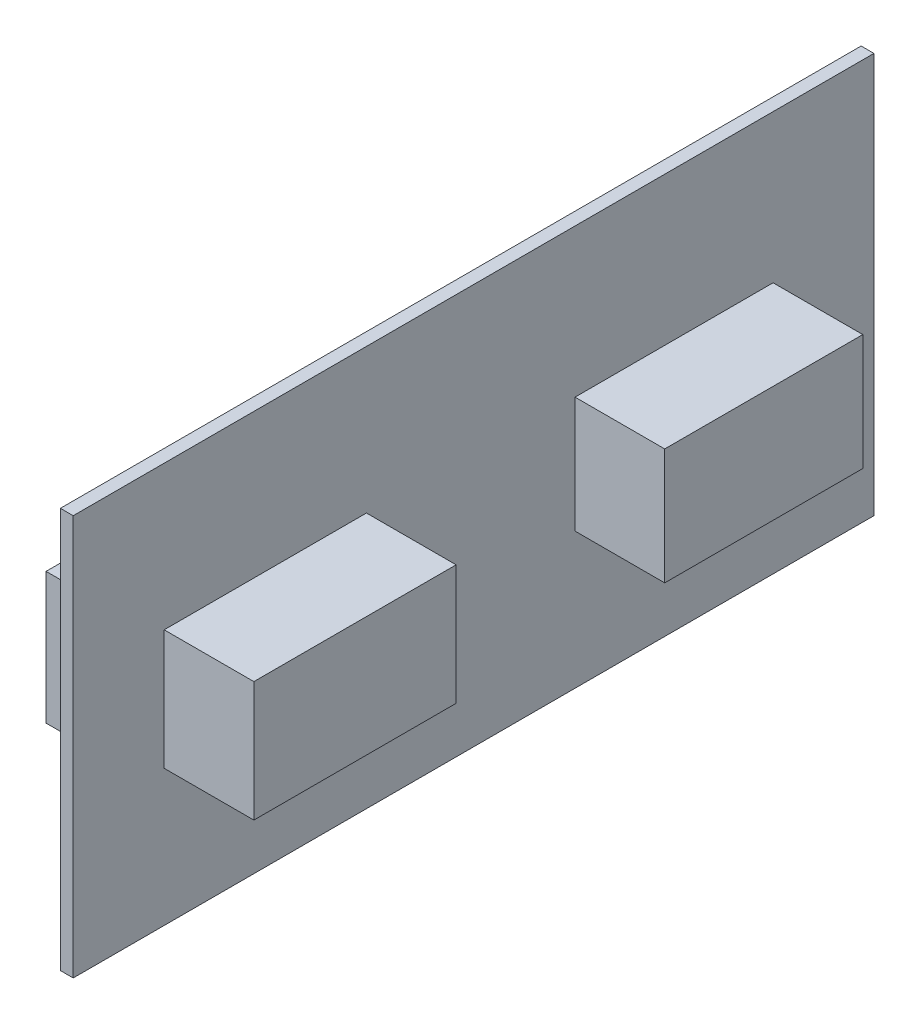
ISO-10303-21;
HEADER;
FILE_DESCRIPTION(('STEP AP214'),'2;1');
FILE_NAME('part.step','',(''),(''),'','','');
FILE_SCHEMA(('AUTOMOTIVE_DESIGN { 1 0 10303 214 1 1 1 1 }'));
ENDSEC;
DATA;
#1=APPLICATION_CONTEXT('core data for automotive mechanical design processes');
#2=APPLICATION_PROTOCOL_DEFINITION('international standard','automotive_design',2000,#1);
#3=PRODUCT_CONTEXT('',#1,'mechanical');
#4=PRODUCT('Part','Part','',(#3));
#5=PRODUCT_RELATED_PRODUCT_CATEGORY('part','',(#4));
#6=PRODUCT_DEFINITION_FORMATION('','',#4);
#7=PRODUCT_DEFINITION_CONTEXT('part definition',#1,'design');
#8=PRODUCT_DEFINITION('design','',#6,#7);
#9=PRODUCT_DEFINITION_SHAPE('','',#8);
#10=(LENGTH_UNIT() NAMED_UNIT(*) SI_UNIT(.MILLI.,.METRE.));
#11=(NAMED_UNIT(*) PLANE_ANGLE_UNIT() SI_UNIT($,.RADIAN.));
#12=(NAMED_UNIT(*) SI_UNIT($,.STERADIAN.) SOLID_ANGLE_UNIT());
#13=UNCERTAINTY_MEASURE_WITH_UNIT(LENGTH_MEASURE(1.E-05),#10,'distance_accuracy_value','');
#14=(GEOMETRIC_REPRESENTATION_CONTEXT(3) GLOBAL_UNCERTAINTY_ASSIGNED_CONTEXT((#13)) GLOBAL_UNIT_ASSIGNED_CONTEXT((#10,
#11,#12)) REPRESENTATION_CONTEXT('',''));
#15=CARTESIAN_POINT('',(0.,0.,0.));
#16=DIRECTION('',(0.,0.,1.));
#17=DIRECTION('',(1.,0.,0.));
#18=AXIS2_PLACEMENT_3D('',#15,#16,#17);
#19=CARTESIAN_POINT('',(8.,0.,0.));
#20=DIRECTION('',(1.,0.,0.));
#21=DIRECTION('',(0.,0.,-1.));
#22=AXIS2_PLACEMENT_3D('',#19,#20,#21);
#23=PLANE('',#22);
#24=DIRECTION('',(0.,0.,1.));
#25=VECTOR('',#24,1.);
#26=CARTESIAN_POINT('',(8.,159.890579244106,316.89479761036));
#27=LINE('',#26,#25);
#28=CARTESIAN_POINT('',(8.,159.890579244106,316.89479761036));
#29=VERTEX_POINT('',#28);
#30=CARTESIAN_POINT('',(8.,159.890579244106,443.194900394769));
#31=VERTEX_POINT('',#30);
#32=EDGE_CURVE('E201',#29,#31,#27,.T.);
#33=ORIENTED_EDGE('',*,*,#32,.F.);
#34=DIRECTION('',(0.,1.,0.));
#35=VECTOR('',#34,1.);
#36=CARTESIAN_POINT('',(8.,84.9918210853673,316.89479761036));
#37=LINE('',#36,#35);
#38=CARTESIAN_POINT('',(8.,84.9918210853673,316.89479761036));
#39=VERTEX_POINT('',#38);
#40=EDGE_CURVE('E198',#39,#29,#37,.T.);
#41=ORIENTED_EDGE('',*,*,#40,.F.);
#42=DIRECTION('',(0.,0.,-1.));
#43=VECTOR('',#42,1.);
#44=CARTESIAN_POINT('',(8.,84.9918210853673,316.89479761036));
#45=LINE('',#44,#43);
#46=CARTESIAN_POINT('',(8.,84.9918210853673,443.194900394769));
#47=VERTEX_POINT('',#46);
#48=EDGE_CURVE('E210',#47,#39,#45,.T.);
#49=ORIENTED_EDGE('',*,*,#48,.F.);
#50=DIRECTION('',(0.,-1.,0.));
#51=VECTOR('',#50,1.);
#52=CARTESIAN_POINT('',(8.,84.9918210853673,443.194900394769));
#53=LINE('',#52,#51);
#54=EDGE_CURVE('E218',#31,#47,#53,.T.);
#55=ORIENTED_EDGE('',*,*,#54,.F.);
#56=EDGE_LOOP('',(#33,#41,#49,#55));
#57=FACE_BOUND('',#56,.T.);
#58=DIRECTION('',(0.,1.,0.));
#59=VECTOR('',#58,1.);
#60=CARTESIAN_POINT('',(8.,0.,0.));
#61=LINE('',#60,#59);
#62=CARTESIAN_POINT('',(8.,0.,0.));
#63=VERTEX_POINT('',#62);
#64=CARTESIAN_POINT('',(8.,250.,0.));
#65=VERTEX_POINT('',#64);
#66=EDGE_CURVE('E296',#63,#65,#61,.T.);
#67=ORIENTED_EDGE('',*,*,#66,.T.);
#68=DIRECTION('',(0.,0.,1.));
#69=VECTOR('',#68,1.);
#70=CARTESIAN_POINT('',(8.,250.,0.));
#71=LINE('',#70,#69);
#72=CARTESIAN_POINT('',(8.,250.,500.));
#73=VERTEX_POINT('',#72);
#74=EDGE_CURVE('E299',#65,#73,#71,.T.);
#75=ORIENTED_EDGE('',*,*,#74,.T.);
#76=DIRECTION('',(0.,-1.,0.));
#77=VECTOR('',#76,1.);
#78=CARTESIAN_POINT('',(8.,0.,500.));
#79=LINE('',#78,#77);
#80=CARTESIAN_POINT('',(8.,0.,500.));
#81=VERTEX_POINT('',#80);
#82=EDGE_CURVE('E302',#73,#81,#79,.T.);
#83=ORIENTED_EDGE('',*,*,#82,.T.);
#84=DIRECTION('',(0.,0.,-1.));
#85=VECTOR('',#84,1.);
#86=CARTESIAN_POINT('',(8.,0.,0.));
#87=LINE('',#86,#85);
#88=EDGE_CURVE('E304',#81,#63,#87,.T.);
#89=ORIENTED_EDGE('',*,*,#88,.T.);
#90=EDGE_LOOP('',(#67,#75,#83,#89));
#91=FACE_BOUND('',#90,.T.);
#92=DIRECTION('',(0.,0.,-1.));
#93=VECTOR('',#92,1.);
#94=CARTESIAN_POINT('',(8.,84.9918210853673,186.644801378378));
#95=LINE('',#94,#93);
#96=CARTESIAN_POINT('',(8.,84.9918210853673,186.644801378378));
#97=VERTEX_POINT('',#96);
#98=CARTESIAN_POINT('',(8.,84.9918210853673,62.9638706911351));
#99=VERTEX_POINT('',#98);
#100=EDGE_CURVE('E596',#97,#99,#95,.T.);
#101=ORIENTED_EDGE('',*,*,#100,.F.);
#102=DIRECTION('',(0.,-1.,0.));
#103=VECTOR('',#102,1.);
#104=CARTESIAN_POINT('',(8.,84.9918210853673,186.644801378378));
#105=LINE('',#104,#103);
#106=CARTESIAN_POINT('',(8.,157.435600201589,186.644801378378));
#107=VERTEX_POINT('',#106);
#108=EDGE_CURVE('E196',#107,#97,#105,.T.);
#109=ORIENTED_EDGE('',*,*,#108,.F.);
#110=DIRECTION('',(0.,0.,1.));
#111=VECTOR('',#110,1.);
#112=CARTESIAN_POINT('',(8.,157.435600201589,186.644801378378));
#113=LINE('',#112,#111);
#114=CARTESIAN_POINT('',(8.,157.435600201589,62.9638706911351));
#115=VERTEX_POINT('',#114);
#116=EDGE_CURVE('E192',#115,#107,#113,.T.);
#117=ORIENTED_EDGE('',*,*,#116,.F.);
#118=DIRECTION('',(0.,1.,0.));
#119=VECTOR('',#118,1.);
#120=CARTESIAN_POINT('',(8.,84.9918210853673,62.9638706911351));
#121=LINE('',#120,#119);
#122=EDGE_CURVE('E593',#99,#115,#121,.T.);
#123=ORIENTED_EDGE('',*,*,#122,.F.);
#124=EDGE_LOOP('',(#101,#109,#117,#123));
#125=FACE_BOUND('',#124,.T.);
#126=ADVANCED_FACE('F35',(#57,#91,#125),#23,.T.);
#127=CARTESIAN_POINT('',(0.,0.,0.));
#128=DIRECTION('',(1.,0.,0.));
#129=DIRECTION('',(0.,0.,-1.));
#130=AXIS2_PLACEMENT_3D('',#127,#128,#129);
#131=PLANE('',#130);
#132=DIRECTION('',(0.,-1.,0.));
#133=VECTOR('',#132,1.);
#134=CARTESIAN_POINT('',(0.,164.379022571797,56.140342989849));
#135=LINE('',#134,#133);
#136=CARTESIAN_POINT('',(0.,164.379022571797,56.140342989849));
#137=VERTEX_POINT('',#136);
#138=CARTESIAN_POINT('',(0.,82.2983494640326,56.140342989849));
#139=VERTEX_POINT('',#138);
#140=EDGE_CURVE('E262',#137,#139,#135,.T.);
#141=ORIENTED_EDGE('',*,*,#140,.F.);
#142=DIRECTION('',(0.,0.,-1.));
#143=VECTOR('',#142,1.);
#144=CARTESIAN_POINT('',(0.,164.379022571797,56.140342989849));
#145=LINE('',#144,#143);
#146=CARTESIAN_POINT('',(0.,164.379022571797,183.007504960074));
#147=VERTEX_POINT('',#146);
#148=EDGE_CURVE('E267',#147,#137,#145,.T.);
#149=ORIENTED_EDGE('',*,*,#148,.F.);
#150=DIRECTION('',(0.,1.,0.));
#151=VECTOR('',#150,1.);
#152=CARTESIAN_POINT('',(0.,164.379022571797,183.007504960074));
#153=LINE('',#152,#151);
#154=CARTESIAN_POINT('',(0.,82.2983494640326,183.007504960074));
#155=VERTEX_POINT('',#154);
#156=EDGE_CURVE('E279',#155,#147,#153,.T.);
#157=ORIENTED_EDGE('',*,*,#156,.F.);
#158=DIRECTION('',(0.,0.,1.));
#159=VECTOR('',#158,1.);
#160=CARTESIAN_POINT('',(0.,82.2983494640326,56.140342989849));
#161=LINE('',#160,#159);
#162=EDGE_CURVE('E276',#139,#155,#161,.T.);
#163=ORIENTED_EDGE('',*,*,#162,.F.);
#164=EDGE_LOOP('',(#141,#149,#157,#163));
#165=FACE_BOUND('',#164,.T.);
#166=DIRECTION('',(0.,1.,0.));
#167=VECTOR('',#166,1.);
#168=CARTESIAN_POINT('',(0.,0.,0.));
#169=LINE('',#168,#167);
#170=CARTESIAN_POINT('',(0.,0.,0.));
#171=VERTEX_POINT('',#170);
#172=CARTESIAN_POINT('',(0.,250.,0.));
#173=VERTEX_POINT('',#172);
#174=EDGE_CURVE('E295',#171,#173,#169,.T.);
#175=ORIENTED_EDGE('',*,*,#174,.F.);
#176=DIRECTION('',(0.,0.,-1.));
#177=VECTOR('',#176,1.);
#178=CARTESIAN_POINT('',(0.,0.,0.));
#179=LINE('',#178,#177);
#180=CARTESIAN_POINT('',(0.,0.,500.));
#181=VERTEX_POINT('',#180);
#182=EDGE_CURVE('E300',#181,#171,#179,.T.);
#183=ORIENTED_EDGE('',*,*,#182,.F.);
#184=DIRECTION('',(0.,-1.,0.));
#185=VECTOR('',#184,1.);
#186=CARTESIAN_POINT('',(0.,0.,500.));
#187=LINE('',#186,#185);
#188=CARTESIAN_POINT('',(0.,250.,500.));
#189=VERTEX_POINT('',#188);
#190=EDGE_CURVE('E311',#189,#181,#187,.T.);
#191=ORIENTED_EDGE('',*,*,#190,.F.);
#192=DIRECTION('',(0.,0.,1.));
#193=VECTOR('',#192,1.);
#194=CARTESIAN_POINT('',(0.,250.,0.));
#195=LINE('',#194,#193);
#196=EDGE_CURVE('E309',#173,#189,#195,.T.);
#197=ORIENTED_EDGE('',*,*,#196,.F.);
#198=EDGE_LOOP('',(#175,#183,#191,#197));
#199=FACE_BOUND('',#198,.T.);
#200=DIRECTION('',(0.,-1.,0.));
#201=VECTOR('',#200,1.);
#202=CARTESIAN_POINT('',(0.,164.379022571797,309.610957113279));
#203=LINE('',#202,#201);
#204=CARTESIAN_POINT('',(0.,164.379022571797,309.610957113279));
#205=VERTEX_POINT('',#204);
#206=CARTESIAN_POINT('',(0.,82.2983494640326,309.610957113279));
#207=VERTEX_POINT('',#206);
#208=EDGE_CURVE('E229',#205,#207,#203,.T.);
#209=ORIENTED_EDGE('',*,*,#208,.F.);
#210=DIRECTION('',(0.,0.,-1.));
#211=VECTOR('',#210,1.);
#212=CARTESIAN_POINT('',(0.,164.379022571797,309.610957113279));
#213=LINE('',#212,#211);
#214=CARTESIAN_POINT('',(0.,164.379022571797,452.95686412075));
#215=VERTEX_POINT('',#214);
#216=EDGE_CURVE('E234',#215,#205,#213,.T.);
#217=ORIENTED_EDGE('',*,*,#216,.F.);
#218=DIRECTION('',(0.,1.,0.));
#219=VECTOR('',#218,1.);
#220=CARTESIAN_POINT('',(0.,164.379022571797,452.95686412075));
#221=LINE('',#220,#219);
#222=CARTESIAN_POINT('',(0.,82.2983494640326,452.95686412075));
#223=VERTEX_POINT('',#222);
#224=EDGE_CURVE('E246',#223,#215,#221,.T.);
#225=ORIENTED_EDGE('',*,*,#224,.F.);
#226=DIRECTION('',(0.,0.,1.));
#227=VECTOR('',#226,1.);
#228=CARTESIAN_POINT('',(0.,82.2983494640326,309.610957113279));
#229=LINE('',#228,#227);
#230=EDGE_CURVE('E243',#207,#223,#229,.T.);
#231=ORIENTED_EDGE('',*,*,#230,.F.);
#232=EDGE_LOOP('',(#209,#217,#225,#231));
#233=FACE_BOUND('',#232,.T.);
#234=ADVANCED_FACE('F329',(#165,#199,#233),#131,.F.);
#235=CARTESIAN_POINT('',(8.,0.,0.));
#236=DIRECTION('',(0.,0.,1.));
#237=DIRECTION('',(1.,0.,0.));
#238=AXIS2_PLACEMENT_3D('',#235,#236,#237);
#239=PLANE('',#238);
#240=ORIENTED_EDGE('',*,*,#174,.T.);
#241=DIRECTION('',(-1.,0.,0.));
#242=VECTOR('',#241,1.);
#243=CARTESIAN_POINT('',(8.,250.,0.));
#244=LINE('',#243,#242);
#245=EDGE_CURVE('E11',#65,#173,#244,.T.);
#246=ORIENTED_EDGE('',*,*,#245,.F.);
#247=ORIENTED_EDGE('',*,*,#66,.F.);
#248=DIRECTION('',(-1.,0.,0.));
#249=VECTOR('',#248,1.);
#250=CARTESIAN_POINT('',(8.,0.,0.));
#251=LINE('',#250,#249);
#252=EDGE_CURVE('E306',#63,#171,#251,.T.);
#253=ORIENTED_EDGE('',*,*,#252,.T.);
#254=EDGE_LOOP('',(#240,#246,#247,#253));
#255=FACE_BOUND('',#254,.T.);
#256=ADVANCED_FACE('F37',(#255),#239,.F.);
#257=CARTESIAN_POINT('',(8.,250.,0.));
#258=DIRECTION('',(0.,-1.,0.));
#259=DIRECTION('',(0.,0.,-1.));
#260=AXIS2_PLACEMENT_3D('',#257,#258,#259);
#261=PLANE('',#260);
#262=ORIENTED_EDGE('',*,*,#196,.T.);
#263=DIRECTION('',(-1.,0.,0.));
#264=VECTOR('',#263,1.);
#265=CARTESIAN_POINT('',(8.,250.,500.));
#266=LINE('',#265,#264);
#267=EDGE_CURVE('E43',#73,#189,#266,.T.);
#268=ORIENTED_EDGE('',*,*,#267,.F.);
#269=ORIENTED_EDGE('',*,*,#74,.F.);
#270=ORIENTED_EDGE('',*,*,#245,.T.);
#271=EDGE_LOOP('',(#262,#268,#269,#270));
#272=FACE_BOUND('',#271,.T.);
#273=ADVANCED_FACE('F340',(#272),#261,.F.);
#274=CARTESIAN_POINT('',(8.,0.,500.));
#275=DIRECTION('',(0.,0.,-1.));
#276=DIRECTION('',(-1.,0.,0.));
#277=AXIS2_PLACEMENT_3D('',#274,#275,#276);
#278=PLANE('',#277);
#279=ORIENTED_EDGE('',*,*,#190,.T.);
#280=DIRECTION('',(-1.,0.,0.));
#281=VECTOR('',#280,1.);
#282=CARTESIAN_POINT('',(8.,0.,500.));
#283=LINE('',#282,#281);
#284=EDGE_CURVE('E316',#81,#181,#283,.T.);
#285=ORIENTED_EDGE('',*,*,#284,.F.);
#286=ORIENTED_EDGE('',*,*,#82,.F.);
#287=ORIENTED_EDGE('',*,*,#267,.T.);
#288=EDGE_LOOP('',(#279,#285,#286,#287));
#289=FACE_BOUND('',#288,.T.);
#290=ADVANCED_FACE('F323',(#289),#278,.F.);
#291=CARTESIAN_POINT('',(8.,0.,0.));
#292=DIRECTION('',(0.,1.,0.));
#293=DIRECTION('',(0.,0.,1.));
#294=AXIS2_PLACEMENT_3D('',#291,#292,#293);
#295=PLANE('',#294);
#296=ORIENTED_EDGE('',*,*,#182,.T.);
#297=ORIENTED_EDGE('',*,*,#252,.F.);
#298=ORIENTED_EDGE('',*,*,#88,.F.);
#299=ORIENTED_EDGE('',*,*,#284,.T.);
#300=EDGE_LOOP('',(#296,#297,#298,#299));
#301=FACE_BOUND('',#300,.T.);
#302=ADVANCED_FACE('F333',(#301),#295,.F.);
#303=CARTESIAN_POINT('',(-56.,164.379022571797,56.140342989849));
#304=DIRECTION('',(0.,0.,1.));
#305=DIRECTION('',(1.,0.,0.));
#306=AXIS2_PLACEMENT_3D('',#303,#304,#305);
#307=PLANE('',#306);
#308=ORIENTED_EDGE('',*,*,#140,.T.);
#309=DIRECTION('',(1.,0.,0.));
#310=VECTOR('',#309,1.);
#311=CARTESIAN_POINT('',(-56.,82.2983494640326,56.140342989849));
#312=LINE('',#311,#310);
#313=CARTESIAN_POINT('',(-56.,82.2983494640326,56.140342989849));
#314=VERTEX_POINT('',#313);
#315=EDGE_CURVE('E292',#314,#139,#312,.T.);
#316=ORIENTED_EDGE('',*,*,#315,.F.);
#317=DIRECTION('',(0.,-1.,0.));
#318=VECTOR('',#317,1.);
#319=CARTESIAN_POINT('',(-56.,164.379022571797,56.140342989849));
#320=LINE('',#319,#318);
#321=CARTESIAN_POINT('',(-56.,164.379022571797,56.140342989849));
#322=VERTEX_POINT('',#321);
#323=EDGE_CURVE('E263',#322,#314,#320,.T.);
#324=ORIENTED_EDGE('',*,*,#323,.F.);
#325=DIRECTION('',(1.,0.,0.));
#326=VECTOR('',#325,1.);
#327=CARTESIAN_POINT('',(-56.,164.379022571797,56.140342989849));
#328=LINE('',#327,#326);
#329=EDGE_CURVE('E273',#322,#137,#328,.T.);
#330=ORIENTED_EDGE('',*,*,#329,.T.);
#331=EDGE_LOOP('',(#308,#316,#324,#330));
#332=FACE_BOUND('',#331,.T.);
#333=ADVANCED_FACE('F359',(#332),#307,.F.);
#334=CARTESIAN_POINT('',(-56.,82.2983494640326,56.140342989849));
#335=DIRECTION('',(0.,1.,0.));
#336=DIRECTION('',(0.,0.,1.));
#337=AXIS2_PLACEMENT_3D('',#334,#335,#336);
#338=PLANE('',#337);
#339=ORIENTED_EDGE('',*,*,#162,.T.);
#340=DIRECTION('',(1.,0.,0.));
#341=VECTOR('',#340,1.);
#342=CARTESIAN_POINT('',(-56.,82.2983494640326,183.007504960074));
#343=LINE('',#342,#341);
#344=CARTESIAN_POINT('',(-56.,82.2983494640326,183.007504960074));
#345=VERTEX_POINT('',#344);
#346=EDGE_CURVE('E289',#345,#155,#343,.T.);
#347=ORIENTED_EDGE('',*,*,#346,.F.);
#348=DIRECTION('',(0.,0.,1.));
#349=VECTOR('',#348,1.);
#350=CARTESIAN_POINT('',(-56.,82.2983494640326,56.140342989849));
#351=LINE('',#350,#349);
#352=EDGE_CURVE('E266',#314,#345,#351,.T.);
#353=ORIENTED_EDGE('',*,*,#352,.F.);
#354=ORIENTED_EDGE('',*,*,#315,.T.);
#355=EDGE_LOOP('',(#339,#347,#353,#354));
#356=FACE_BOUND('',#355,.T.);
#357=ADVANCED_FACE('F367',(#356),#338,.F.);
#358=CARTESIAN_POINT('',(-56.,164.379022571797,183.007504960074));
#359=DIRECTION('',(0.,0.,-1.));
#360=DIRECTION('',(0.,1.,0.));
#361=AXIS2_PLACEMENT_3D('',#358,#359,#360);
#362=PLANE('',#361);
#363=ORIENTED_EDGE('',*,*,#156,.T.);
#364=DIRECTION('',(1.,0.,0.));
#365=VECTOR('',#364,1.);
#366=CARTESIAN_POINT('',(-56.,164.379022571797,183.007504960074));
#367=LINE('',#366,#365);
#368=CARTESIAN_POINT('',(-56.,164.379022571797,183.007504960074));
#369=VERTEX_POINT('',#368);
#370=EDGE_CURVE('E286',#369,#147,#367,.T.);
#371=ORIENTED_EDGE('',*,*,#370,.F.);
#372=DIRECTION('',(0.,1.,0.));
#373=VECTOR('',#372,1.);
#374=CARTESIAN_POINT('',(-56.,164.379022571797,183.007504960074));
#375=LINE('',#374,#373);
#376=EDGE_CURVE('E269',#345,#369,#375,.T.);
#377=ORIENTED_EDGE('',*,*,#376,.F.);
#378=ORIENTED_EDGE('',*,*,#346,.T.);
#379=EDGE_LOOP('',(#363,#371,#377,#378));
#380=FACE_BOUND('',#379,.T.);
#381=ADVANCED_FACE('F372',(#380),#362,.F.);
#382=CARTESIAN_POINT('',(-56.,164.379022571797,56.140342989849));
#383=DIRECTION('',(0.,-1.,0.));
#384=DIRECTION('',(0.,0.,-1.));
#385=AXIS2_PLACEMENT_3D('',#382,#383,#384);
#386=PLANE('',#385);
#387=ORIENTED_EDGE('',*,*,#148,.T.);
#388=ORIENTED_EDGE('',*,*,#329,.F.);
#389=DIRECTION('',(0.,0.,-1.));
#390=VECTOR('',#389,1.);
#391=CARTESIAN_POINT('',(-56.,164.379022571797,56.140342989849));
#392=LINE('',#391,#390);
#393=EDGE_CURVE('E271',#369,#322,#392,.T.);
#394=ORIENTED_EDGE('',*,*,#393,.F.);
#395=ORIENTED_EDGE('',*,*,#370,.T.);
#396=EDGE_LOOP('',(#387,#388,#394,#395));
#397=FACE_BOUND('',#396,.T.);
#398=ADVANCED_FACE('F378',(#397),#386,.F.);
#399=CARTESIAN_POINT('',(-56.,0.,0.));
#400=DIRECTION('',(-1.,0.,0.));
#401=DIRECTION('',(0.,0.,1.));
#402=AXIS2_PLACEMENT_3D('',#399,#400,#401);
#403=PLANE('',#402);
#404=ORIENTED_EDGE('',*,*,#323,.T.);
#405=ORIENTED_EDGE('',*,*,#352,.T.);
#406=ORIENTED_EDGE('',*,*,#376,.T.);
#407=ORIENTED_EDGE('',*,*,#393,.T.);
#408=EDGE_LOOP('',(#404,#405,#406,#407));
#409=FACE_BOUND('',#408,.T.);
#410=ADVANCED_FACE('F385',(#409),#403,.T.);
#411=CARTESIAN_POINT('',(-56.,164.379022571797,309.610957113279));
#412=DIRECTION('',(0.,0.,1.));
#413=DIRECTION('',(1.,0.,0.));
#414=AXIS2_PLACEMENT_3D('',#411,#412,#413);
#415=PLANE('',#414);
#416=ORIENTED_EDGE('',*,*,#208,.T.);
#417=DIRECTION('',(1.,0.,0.));
#418=VECTOR('',#417,1.);
#419=CARTESIAN_POINT('',(-56.,82.2983494640326,309.610957113279));
#420=LINE('',#419,#418);
#421=CARTESIAN_POINT('',(-56.,82.2983494640326,309.610957113279));
#422=VERTEX_POINT('',#421);
#423=EDGE_CURVE('E259',#422,#207,#420,.T.);
#424=ORIENTED_EDGE('',*,*,#423,.F.);
#425=DIRECTION('',(0.,-1.,0.));
#426=VECTOR('',#425,1.);
#427=CARTESIAN_POINT('',(-56.,164.379022571797,309.610957113279));
#428=LINE('',#427,#426);
#429=CARTESIAN_POINT('',(-56.,164.379022571797,309.610957113279));
#430=VERTEX_POINT('',#429);
#431=EDGE_CURVE('E230',#430,#422,#428,.T.);
#432=ORIENTED_EDGE('',*,*,#431,.F.);
#433=DIRECTION('',(1.,0.,0.));
#434=VECTOR('',#433,1.);
#435=CARTESIAN_POINT('',(-56.,164.379022571797,309.610957113279));
#436=LINE('',#435,#434);
#437=EDGE_CURVE('E240',#430,#205,#436,.T.);
#438=ORIENTED_EDGE('',*,*,#437,.T.);
#439=EDGE_LOOP('',(#416,#424,#432,#438));
#440=FACE_BOUND('',#439,.T.);
#441=ADVANCED_FACE('F387',(#440),#415,.F.);
#442=CARTESIAN_POINT('',(-56.,82.2983494640326,309.610957113279));
#443=DIRECTION('',(0.,1.,0.));
#444=DIRECTION('',(0.,0.,1.));
#445=AXIS2_PLACEMENT_3D('',#442,#443,#444);
#446=PLANE('',#445);
#447=ORIENTED_EDGE('',*,*,#230,.T.);
#448=DIRECTION('',(1.,0.,0.));
#449=VECTOR('',#448,1.);
#450=CARTESIAN_POINT('',(-56.,82.2983494640326,452.95686412075));
#451=LINE('',#450,#449);
#452=CARTESIAN_POINT('',(-56.,82.2983494640326,452.95686412075));
#453=VERTEX_POINT('',#452);
#454=EDGE_CURVE('E256',#453,#223,#451,.T.);
#455=ORIENTED_EDGE('',*,*,#454,.F.);
#456=DIRECTION('',(0.,0.,1.));
#457=VECTOR('',#456,1.);
#458=CARTESIAN_POINT('',(-56.,82.2983494640326,309.610957113279));
#459=LINE('',#458,#457);
#460=EDGE_CURVE('E233',#422,#453,#459,.T.);
#461=ORIENTED_EDGE('',*,*,#460,.F.);
#462=ORIENTED_EDGE('',*,*,#423,.T.);
#463=EDGE_LOOP('',(#447,#455,#461,#462));
#464=FACE_BOUND('',#463,.T.);
#465=ADVANCED_FACE('F393',(#464),#446,.F.);
#466=CARTESIAN_POINT('',(-56.,164.379022571797,452.95686412075));
#467=DIRECTION('',(0.,0.,-1.));
#468=DIRECTION('',(-1.,0.,0.));
#469=AXIS2_PLACEMENT_3D('',#466,#467,#468);
#470=PLANE('',#469);
#471=ORIENTED_EDGE('',*,*,#224,.T.);
#472=DIRECTION('',(1.,0.,0.));
#473=VECTOR('',#472,1.);
#474=CARTESIAN_POINT('',(-56.,164.379022571797,452.95686412075));
#475=LINE('',#474,#473);
#476=CARTESIAN_POINT('',(-56.,164.379022571797,452.95686412075));
#477=VERTEX_POINT('',#476);
#478=EDGE_CURVE('E253',#477,#215,#475,.T.);
#479=ORIENTED_EDGE('',*,*,#478,.F.);
#480=DIRECTION('',(0.,1.,0.));
#481=VECTOR('',#480,1.);
#482=CARTESIAN_POINT('',(-56.,164.379022571797,452.95686412075));
#483=LINE('',#482,#481);
#484=EDGE_CURVE('E236',#453,#477,#483,.T.);
#485=ORIENTED_EDGE('',*,*,#484,.F.);
#486=ORIENTED_EDGE('',*,*,#454,.T.);
#487=EDGE_LOOP('',(#471,#479,#485,#486));
#488=FACE_BOUND('',#487,.T.);
#489=ADVANCED_FACE('F427',(#488),#470,.F.);
#490=CARTESIAN_POINT('',(-56.,164.379022571797,309.610957113279));
#491=DIRECTION('',(0.,-1.,0.));
#492=DIRECTION('',(0.,0.,-1.));
#493=AXIS2_PLACEMENT_3D('',#490,#491,#492);
#494=PLANE('',#493);
#495=ORIENTED_EDGE('',*,*,#216,.T.);
#496=ORIENTED_EDGE('',*,*,#437,.F.);
#497=DIRECTION('',(0.,0.,-1.));
#498=VECTOR('',#497,1.);
#499=CARTESIAN_POINT('',(-56.,164.379022571797,309.610957113279));
#500=LINE('',#499,#498);
#501=EDGE_CURVE('E238',#477,#430,#500,.T.);
#502=ORIENTED_EDGE('',*,*,#501,.F.);
#503=ORIENTED_EDGE('',*,*,#478,.T.);
#504=EDGE_LOOP('',(#495,#496,#502,#503));
#505=FACE_BOUND('',#504,.T.);
#506=ADVANCED_FACE('F436',(#505),#494,.F.);
#507=CARTESIAN_POINT('',(-56.,0.,0.));
#508=DIRECTION('',(-1.,0.,0.));
#509=DIRECTION('',(0.,0.,1.));
#510=AXIS2_PLACEMENT_3D('',#507,#508,#509);
#511=PLANE('',#510);
#512=ORIENTED_EDGE('',*,*,#431,.T.);
#513=ORIENTED_EDGE('',*,*,#460,.T.);
#514=ORIENTED_EDGE('',*,*,#484,.T.);
#515=ORIENTED_EDGE('',*,*,#501,.T.);
#516=EDGE_LOOP('',(#512,#513,#514,#515));
#517=FACE_BOUND('',#516,.T.);
#518=ADVANCED_FACE('F446',(#517),#511,.T.);
#519=CARTESIAN_POINT('',(64.,84.9918210853673,316.89479761036));
#520=DIRECTION('',(0.,0.,1.));
#521=DIRECTION('',(1.,0.,0.));
#522=AXIS2_PLACEMENT_3D('',#519,#520,#521);
#523=PLANE('',#522);
#524=ORIENTED_EDGE('',*,*,#40,.T.);
#525=DIRECTION('',(-1.,0.,0.));
#526=VECTOR('',#525,1.);
#527=CARTESIAN_POINT('',(64.,159.890579244106,316.89479761036));
#528=LINE('',#527,#526);
#529=CARTESIAN_POINT('',(64.,159.890579244106,316.89479761036));
#530=VERTEX_POINT('',#529);
#531=EDGE_CURVE('E227',#530,#29,#528,.T.);
#532=ORIENTED_EDGE('',*,*,#531,.F.);
#533=DIRECTION('',(0.,1.,0.));
#534=VECTOR('',#533,1.);
#535=CARTESIAN_POINT('',(64.,84.9918210853673,316.89479761036));
#536=LINE('',#535,#534);
#537=CARTESIAN_POINT('',(64.,84.9918210853673,316.89479761036));
#538=VERTEX_POINT('',#537);
#539=EDGE_CURVE('E206',#538,#530,#536,.T.);
#540=ORIENTED_EDGE('',*,*,#539,.F.);
#541=DIRECTION('',(-1.,0.,0.));
#542=VECTOR('',#541,1.);
#543=CARTESIAN_POINT('',(64.,84.9918210853673,316.89479761036));
#544=LINE('',#543,#542);
#545=EDGE_CURVE('E215',#538,#39,#544,.T.);
#546=ORIENTED_EDGE('',*,*,#545,.T.);
#547=EDGE_LOOP('',(#524,#532,#540,#546));
#548=FACE_BOUND('',#547,.T.);
#549=ADVANCED_FACE('F457',(#548),#523,.F.);
#550=CARTESIAN_POINT('',(64.,159.890579244106,316.89479761036));
#551=DIRECTION('',(0.,-1.,0.));
#552=DIRECTION('',(0.,0.,-1.));
#553=AXIS2_PLACEMENT_3D('',#550,#551,#552);
#554=PLANE('',#553);
#555=ORIENTED_EDGE('',*,*,#32,.T.);
#556=DIRECTION('',(-1.,0.,0.));
#557=VECTOR('',#556,1.);
#558=CARTESIAN_POINT('',(64.,159.890579244106,443.194900394769));
#559=LINE('',#558,#557);
#560=CARTESIAN_POINT('',(64.,159.890579244106,443.194900394769));
#561=VERTEX_POINT('',#560);
#562=EDGE_CURVE('E224',#561,#31,#559,.T.);
#563=ORIENTED_EDGE('',*,*,#562,.F.);
#564=DIRECTION('',(0.,0.,1.));
#565=VECTOR('',#564,1.);
#566=CARTESIAN_POINT('',(64.,159.890579244106,316.89479761036));
#567=LINE('',#566,#565);
#568=EDGE_CURVE('E209',#530,#561,#567,.T.);
#569=ORIENTED_EDGE('',*,*,#568,.F.);
#570=ORIENTED_EDGE('',*,*,#531,.T.);
#571=EDGE_LOOP('',(#555,#563,#569,#570));
#572=FACE_BOUND('',#571,.T.);
#573=ADVANCED_FACE('F467',(#572),#554,.F.);
#574=CARTESIAN_POINT('',(64.,84.9918210853673,443.194900394769));
#575=DIRECTION('',(0.,0.,-1.));
#576=DIRECTION('',(-1.,0.,0.));
#577=AXIS2_PLACEMENT_3D('',#574,#575,#576);
#578=PLANE('',#577);
#579=ORIENTED_EDGE('',*,*,#54,.T.);
#580=DIRECTION('',(-1.,0.,0.));
#581=VECTOR('',#580,1.);
#582=CARTESIAN_POINT('',(64.,84.9918210853673,443.194900394769));
#583=LINE('',#582,#581);
#584=CARTESIAN_POINT('',(64.,84.9918210853673,443.194900394769));
#585=VERTEX_POINT('',#584);
#586=EDGE_CURVE('E58',#585,#47,#583,.T.);
#587=ORIENTED_EDGE('',*,*,#586,.F.);
#588=DIRECTION('',(0.,-1.,0.));
#589=VECTOR('',#588,1.);
#590=CARTESIAN_POINT('',(64.,84.9918210853673,443.194900394769));
#591=LINE('',#590,#589);
#592=EDGE_CURVE('E212',#561,#585,#591,.T.);
#593=ORIENTED_EDGE('',*,*,#592,.F.);
#594=ORIENTED_EDGE('',*,*,#562,.T.);
#595=EDGE_LOOP('',(#579,#587,#593,#594));
#596=FACE_BOUND('',#595,.T.);
#597=ADVANCED_FACE('F477',(#596),#578,.F.);
#598=CARTESIAN_POINT('',(64.,84.9918210853673,316.89479761036));
#599=DIRECTION('',(0.,1.,0.));
#600=DIRECTION('',(0.,0.,1.));
#601=AXIS2_PLACEMENT_3D('',#598,#599,#600);
#602=PLANE('',#601);
#603=ORIENTED_EDGE('',*,*,#48,.T.);
#604=ORIENTED_EDGE('',*,*,#545,.F.);
#605=DIRECTION('',(0.,0.,-1.));
#606=VECTOR('',#605,1.);
#607=CARTESIAN_POINT('',(64.,84.9918210853673,316.89479761036));
#608=LINE('',#607,#606);
#609=EDGE_CURVE('E214',#585,#538,#608,.T.);
#610=ORIENTED_EDGE('',*,*,#609,.F.);
#611=ORIENTED_EDGE('',*,*,#586,.T.);
#612=EDGE_LOOP('',(#603,#604,#610,#611));
#613=FACE_BOUND('',#612,.T.);
#614=ADVANCED_FACE('F487',(#613),#602,.F.);
#615=CARTESIAN_POINT('',(64.,0.,0.));
#616=DIRECTION('',(1.,0.,0.));
#617=DIRECTION('',(0.,0.,-1.));
#618=AXIS2_PLACEMENT_3D('',#615,#616,#617);
#619=PLANE('',#618);
#620=ORIENTED_EDGE('',*,*,#539,.T.);
#621=ORIENTED_EDGE('',*,*,#568,.T.);
#622=ORIENTED_EDGE('',*,*,#592,.T.);
#623=ORIENTED_EDGE('',*,*,#609,.T.);
#624=EDGE_LOOP('',(#620,#621,#622,#623));
#625=FACE_BOUND('',#624,.T.);
#626=ADVANCED_FACE('F496',(#625),#619,.T.);
#627=CARTESIAN_POINT('',(64.,84.9918210853673,186.644801378378));
#628=DIRECTION('',(0.,0.,-1.));
#629=DIRECTION('',(-1.,0.,0.));
#630=AXIS2_PLACEMENT_3D('',#627,#628,#629);
#631=PLANE('',#630);
#632=ORIENTED_EDGE('',*,*,#108,.T.);
#633=DIRECTION('',(-1.,0.,0.));
#634=VECTOR('',#633,1.);
#635=CARTESIAN_POINT('',(64.,84.9918210853673,186.644801378378));
#636=LINE('',#635,#634);
#637=CARTESIAN_POINT('',(64.,84.9918210853673,186.644801378378));
#638=VERTEX_POINT('',#637);
#639=EDGE_CURVE('E177',#638,#97,#636,.T.);
#640=ORIENTED_EDGE('',*,*,#639,.F.);
#641=DIRECTION('',(0.,-1.,0.));
#642=VECTOR('',#641,1.);
#643=CARTESIAN_POINT('',(64.,84.9918210853673,186.644801378378));
#644=LINE('',#643,#642);
#645=CARTESIAN_POINT('',(64.,157.435600201589,186.644801378378));
#646=VERTEX_POINT('',#645);
#647=EDGE_CURVE('E184',#646,#638,#644,.T.);
#648=ORIENTED_EDGE('',*,*,#647,.F.);
#649=DIRECTION('',(-1.,0.,0.));
#650=VECTOR('',#649,1.);
#651=CARTESIAN_POINT('',(64.,157.435600201589,186.644801378378));
#652=LINE('',#651,#650);
#653=EDGE_CURVE('E591',#646,#107,#652,.T.);
#654=ORIENTED_EDGE('',*,*,#653,.T.);
#655=EDGE_LOOP('',(#632,#640,#648,#654));
#656=FACE_BOUND('',#655,.T.);
#657=ADVANCED_FACE('F194',(#656),#631,.F.);
#658=CARTESIAN_POINT('',(64.,84.9918210853673,186.644801378378));
#659=DIRECTION('',(0.,1.,0.));
#660=DIRECTION('',(0.,0.,1.));
#661=AXIS2_PLACEMENT_3D('',#658,#659,#660);
#662=PLANE('',#661);
#663=ORIENTED_EDGE('',*,*,#100,.T.);
#664=DIRECTION('',(-1.,0.,0.));
#665=VECTOR('',#664,1.);
#666=CARTESIAN_POINT('',(64.,84.9918210853673,62.9638706911351));
#667=LINE('',#666,#665);
#668=CARTESIAN_POINT('',(64.,84.9918210853673,62.9638706911351));
#669=VERTEX_POINT('',#668);
#670=EDGE_CURVE('E180',#669,#99,#667,.T.);
#671=ORIENTED_EDGE('',*,*,#670,.F.);
#672=DIRECTION('',(0.,0.,-1.));
#673=VECTOR('',#672,1.);
#674=CARTESIAN_POINT('',(64.,84.9918210853673,186.644801378378));
#675=LINE('',#674,#673);
#676=EDGE_CURVE('E173',#638,#669,#675,.T.);
#677=ORIENTED_EDGE('',*,*,#676,.F.);
#678=ORIENTED_EDGE('',*,*,#639,.T.);
#679=EDGE_LOOP('',(#663,#671,#677,#678));
#680=FACE_BOUND('',#679,.T.);
#681=ADVANCED_FACE('F175',(#680),#662,.F.);
#682=CARTESIAN_POINT('',(64.,84.9918210853673,62.9638706911351));
#683=DIRECTION('',(0.,0.,1.));
#684=DIRECTION('',(1.,0.,0.));
#685=AXIS2_PLACEMENT_3D('',#682,#683,#684);
#686=PLANE('',#685);
#687=ORIENTED_EDGE('',*,*,#122,.T.);
#688=DIRECTION('',(-1.,0.,0.));
#689=VECTOR('',#688,1.);
#690=CARTESIAN_POINT('',(64.,157.435600201589,62.9638706911351));
#691=LINE('',#690,#689);
#692=CARTESIAN_POINT('',(64.,157.435600201589,62.9638706911351));
#693=VERTEX_POINT('',#692);
#694=EDGE_CURVE('E50',#693,#115,#691,.T.);
#695=ORIENTED_EDGE('',*,*,#694,.F.);
#696=DIRECTION('',(0.,1.,0.));
#697=VECTOR('',#696,1.);
#698=CARTESIAN_POINT('',(64.,84.9918210853673,62.9638706911351));
#699=LINE('',#698,#697);
#700=EDGE_CURVE('E183',#669,#693,#699,.T.);
#701=ORIENTED_EDGE('',*,*,#700,.F.);
#702=ORIENTED_EDGE('',*,*,#670,.T.);
#703=EDGE_LOOP('',(#687,#695,#701,#702));
#704=FACE_BOUND('',#703,.T.);
#705=ADVANCED_FACE('F519',(#704),#686,.F.);
#706=CARTESIAN_POINT('',(64.,157.435600201589,186.644801378378));
#707=DIRECTION('',(0.,-1.,0.));
#708=DIRECTION('',(0.,0.,-1.));
#709=AXIS2_PLACEMENT_3D('',#706,#707,#708);
#710=PLANE('',#709);
#711=ORIENTED_EDGE('',*,*,#116,.T.);
#712=ORIENTED_EDGE('',*,*,#653,.F.);
#713=DIRECTION('',(0.,0.,1.));
#714=VECTOR('',#713,1.);
#715=CARTESIAN_POINT('',(64.,157.435600201589,186.644801378378));
#716=LINE('',#715,#714);
#717=EDGE_CURVE('E188',#693,#646,#716,.T.);
#718=ORIENTED_EDGE('',*,*,#717,.F.);
#719=ORIENTED_EDGE('',*,*,#694,.T.);
#720=EDGE_LOOP('',(#711,#712,#718,#719));
#721=FACE_BOUND('',#720,.T.);
#722=ADVANCED_FACE('F526',(#721),#710,.F.);
#723=CARTESIAN_POINT('',(64.,0.,0.));
#724=DIRECTION('',(-1.,0.,0.));
#725=DIRECTION('',(0.,0.,1.));
#726=AXIS2_PLACEMENT_3D('',#723,#724,#725);
#727=PLANE('',#726);
#728=ORIENTED_EDGE('',*,*,#647,.T.);
#729=ORIENTED_EDGE('',*,*,#676,.T.);
#730=ORIENTED_EDGE('',*,*,#700,.T.);
#731=ORIENTED_EDGE('',*,*,#717,.T.);
#732=EDGE_LOOP('',(#728,#729,#730,#731));
#733=FACE_BOUND('',#732,.T.);
#734=ADVANCED_FACE('F187',(#733),#727,.F.);
#735=CLOSED_SHELL('',(#126,#234,#256,#273,#290,#302,#333,#357,#381,#398,#410,#441,#465,#489,
#506,#518,#549,#573,#597,#614,#626,#657,#681,#705,#722,#734));
#736=MANIFOLD_SOLID_BREP('B2',#735);
#737=ADVANCED_BREP_SHAPE_REPRESENTATION('',(#18,#736),#14);
#738=SHAPE_DEFINITION_REPRESENTATION(#9,#737);
ENDSEC;
END-ISO-10303-21;
